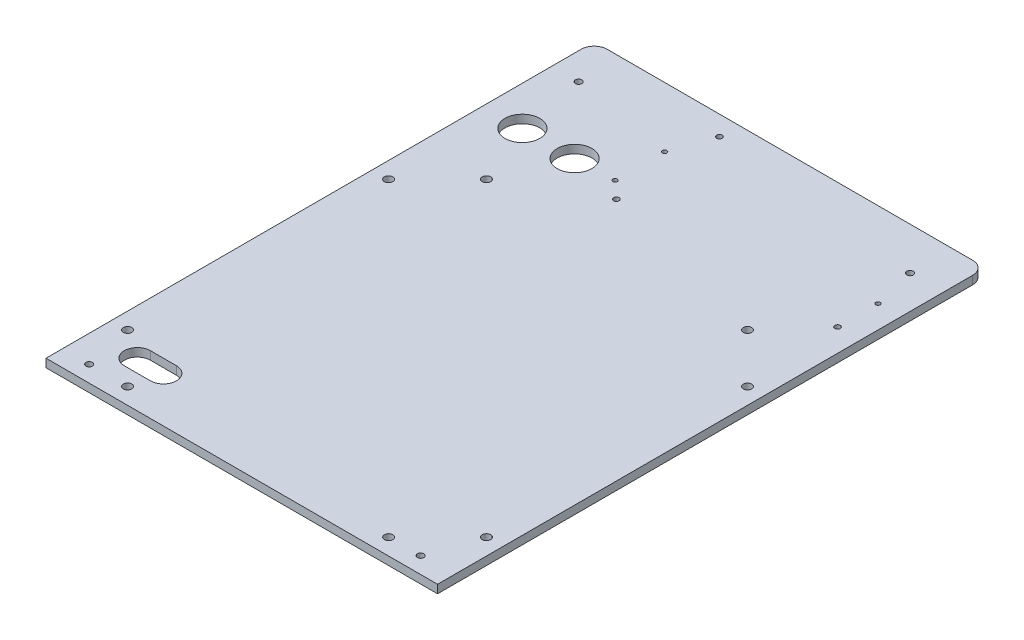
ISO-10303-21;
HEADER;
FILE_DESCRIPTION(('STEP AP214'),'2;1');
FILE_NAME('part.step','',(''),(''),'','','');
FILE_SCHEMA(('AUTOMOTIVE_DESIGN { 1 0 10303 214 1 1 1 1 }'));
ENDSEC;
DATA;
#1=APPLICATION_CONTEXT('core data for automotive mechanical design processes');
#2=APPLICATION_PROTOCOL_DEFINITION('international standard','automotive_design',2000,#1);
#3=PRODUCT_CONTEXT('',#1,'mechanical');
#4=PRODUCT('Part','Part','',(#3));
#5=PRODUCT_RELATED_PRODUCT_CATEGORY('part','',(#4));
#6=PRODUCT_DEFINITION_FORMATION('','',#4);
#7=PRODUCT_DEFINITION_CONTEXT('part definition',#1,'design');
#8=PRODUCT_DEFINITION('design','',#6,#7);
#9=PRODUCT_DEFINITION_SHAPE('','',#8);
#10=(LENGTH_UNIT() NAMED_UNIT(*) SI_UNIT(.MILLI.,.METRE.));
#11=(NAMED_UNIT(*) PLANE_ANGLE_UNIT() SI_UNIT($,.RADIAN.));
#12=(NAMED_UNIT(*) SI_UNIT($,.STERADIAN.) SOLID_ANGLE_UNIT());
#13=UNCERTAINTY_MEASURE_WITH_UNIT(LENGTH_MEASURE(1.E-05),#10,'distance_accuracy_value','');
#14=(GEOMETRIC_REPRESENTATION_CONTEXT(3) GLOBAL_UNCERTAINTY_ASSIGNED_CONTEXT((#13)) GLOBAL_UNIT_ASSIGNED_CONTEXT((#10,
#11,#12)) REPRESENTATION_CONTEXT('',''));
#15=CARTESIAN_POINT('',(0.,0.,0.));
#16=DIRECTION('',(0.,0.,1.));
#17=DIRECTION('',(1.,0.,0.));
#18=AXIS2_PLACEMENT_3D('',#15,#16,#17);
#19=CARTESIAN_POINT('',(300.,6.35,0.));
#20=DIRECTION('',(-1.,0.,0.));
#21=DIRECTION('',(0.,0.,1.));
#22=AXIS2_PLACEMENT_3D('',#19,#20,#21);
#23=PLANE('',#22);
#24=DIRECTION('',(0.,1.,0.));
#25=VECTOR('',#24,1.);
#26=CARTESIAN_POINT('',(300.,-3.65,-410.));
#27=LINE('',#26,#25);
#28=CARTESIAN_POINT('',(300.,0.,-410.));
#29=VERTEX_POINT('',#28);
#30=CARTESIAN_POINT('',(300.,6.35,-410.));
#31=VERTEX_POINT('',#30);
#32=EDGE_CURVE('E181',#29,#31,#27,.T.);
#33=ORIENTED_EDGE('',*,*,#32,.T.);
#34=DIRECTION('',(0.,0.,-1.));
#35=VECTOR('',#34,1.);
#36=CARTESIAN_POINT('',(300.,6.35,0.));
#37=LINE('',#36,#35);
#38=CARTESIAN_POINT('',(300.,6.35,0.));
#39=VERTEX_POINT('',#38);
#40=EDGE_CURVE('E288',#39,#31,#37,.T.);
#41=ORIENTED_EDGE('',*,*,#40,.F.);
#42=DIRECTION('',(0.,-1.,0.));
#43=VECTOR('',#42,1.);
#44=CARTESIAN_POINT('',(300.,6.35,0.));
#45=LINE('',#44,#43);
#46=CARTESIAN_POINT('',(300.,0.,0.));
#47=VERTEX_POINT('',#46);
#48=EDGE_CURVE('E294',#39,#47,#45,.T.);
#49=ORIENTED_EDGE('',*,*,#48,.T.);
#50=DIRECTION('',(0.,0.,-1.));
#51=VECTOR('',#50,1.);
#52=CARTESIAN_POINT('',(300.,0.,0.));
#53=LINE('',#52,#51);
#54=EDGE_CURVE('E298',#47,#29,#53,.T.);
#55=ORIENTED_EDGE('',*,*,#54,.T.);
#56=EDGE_LOOP('',(#33,#41,#49,#55));
#57=FACE_BOUND('',#56,.T.);
#58=ADVANCED_FACE('F36',(#57),#23,.F.);
#59=CARTESIAN_POINT('',(0.,6.35,-420.));
#60=DIRECTION('',(0.,0.,1.));
#61=DIRECTION('',(1.,0.,0.));
#62=AXIS2_PLACEMENT_3D('',#59,#60,#61);
#63=PLANE('',#62);
#64=DIRECTION('',(-1.,0.,0.));
#65=VECTOR('',#64,1.);
#66=CARTESIAN_POINT('',(0.,6.35,-420.));
#67=LINE('',#66,#65);
#68=CARTESIAN_POINT('',(290.,6.35,-420.));
#69=VERTEX_POINT('',#68);
#70=CARTESIAN_POINT('',(10.,6.35,-420.));
#71=VERTEX_POINT('',#70);
#72=EDGE_CURVE('E291',#69,#71,#67,.T.);
#73=ORIENTED_EDGE('',*,*,#72,.F.);
#74=DIRECTION('',(0.,1.,0.));
#75=VECTOR('',#74,1.);
#76=CARTESIAN_POINT('',(290.,-3.65,-420.));
#77=LINE('',#76,#75);
#78=CARTESIAN_POINT('',(290.,0.,-420.));
#79=VERTEX_POINT('',#78);
#80=EDGE_CURVE('E183',#79,#69,#77,.T.);
#81=ORIENTED_EDGE('',*,*,#80,.F.);
#82=DIRECTION('',(-1.,0.,0.));
#83=VECTOR('',#82,1.);
#84=CARTESIAN_POINT('',(0.,0.,-420.));
#85=LINE('',#84,#83);
#86=CARTESIAN_POINT('',(10.,0.,-420.));
#87=VERTEX_POINT('',#86);
#88=EDGE_CURVE('E286',#79,#87,#85,.T.);
#89=ORIENTED_EDGE('',*,*,#88,.T.);
#90=DIRECTION('',(0.,1.,0.));
#91=VECTOR('',#90,1.);
#92=CARTESIAN_POINT('',(10.,-3.65,-420.));
#93=LINE('',#92,#91);
#94=EDGE_CURVE('E189',#87,#71,#93,.T.);
#95=ORIENTED_EDGE('',*,*,#94,.T.);
#96=EDGE_LOOP('',(#73,#81,#89,#95));
#97=FACE_BOUND('',#96,.T.);
#98=ADVANCED_FACE('F332',(#97),#63,.F.);
#99=CARTESIAN_POINT('',(0.,6.35,0.));
#100=DIRECTION('',(1.,0.,0.));
#101=DIRECTION('',(0.,0.,-1.));
#102=AXIS2_PLACEMENT_3D('',#99,#100,#101);
#103=PLANE('',#102);
#104=DIRECTION('',(0.,0.,1.));
#105=VECTOR('',#104,1.);
#106=CARTESIAN_POINT('',(0.,6.35,0.));
#107=LINE('',#106,#105);
#108=CARTESIAN_POINT('',(0.,6.35,-410.));
#109=VERTEX_POINT('',#108);
#110=CARTESIAN_POINT('',(0.,6.35,0.));
#111=VERTEX_POINT('',#110);
#112=EDGE_CURVE('E283',#109,#111,#107,.T.);
#113=ORIENTED_EDGE('',*,*,#112,.F.);
#114=DIRECTION('',(0.,1.,0.));
#115=VECTOR('',#114,1.);
#116=CARTESIAN_POINT('',(0.,-3.65,-410.));
#117=LINE('',#116,#115);
#118=CARTESIAN_POINT('',(0.,0.,-410.));
#119=VERTEX_POINT('',#118);
#120=EDGE_CURVE('E182',#119,#109,#117,.T.);
#121=ORIENTED_EDGE('',*,*,#120,.F.);
#122=DIRECTION('',(0.,0.,1.));
#123=VECTOR('',#122,1.);
#124=CARTESIAN_POINT('',(0.,0.,0.));
#125=LINE('',#124,#123);
#126=CARTESIAN_POINT('',(0.,0.,0.));
#127=VERTEX_POINT('',#126);
#128=EDGE_CURVE('E280',#119,#127,#125,.T.);
#129=ORIENTED_EDGE('',*,*,#128,.T.);
#130=DIRECTION('',(0.,-1.,0.));
#131=VECTOR('',#130,1.);
#132=CARTESIAN_POINT('',(0.,6.35,0.));
#133=LINE('',#132,#131);
#134=EDGE_CURVE('E305',#111,#127,#133,.T.);
#135=ORIENTED_EDGE('',*,*,#134,.F.);
#136=EDGE_LOOP('',(#113,#121,#129,#135));
#137=FACE_BOUND('',#136,.T.);
#138=ADVANCED_FACE('F38',(#137),#103,.F.);
#139=CARTESIAN_POINT('',(0.,6.35,0.));
#140=DIRECTION('',(0.,0.,-1.));
#141=DIRECTION('',(-1.,0.,0.));
#142=AXIS2_PLACEMENT_3D('',#139,#140,#141);
#143=PLANE('',#142);
#144=DIRECTION('',(1.,0.,0.));
#145=VECTOR('',#144,1.);
#146=CARTESIAN_POINT('',(0.,0.,0.));
#147=LINE('',#146,#145);
#148=EDGE_CURVE('E296',#127,#47,#147,.T.);
#149=ORIENTED_EDGE('',*,*,#148,.T.);
#150=ORIENTED_EDGE('',*,*,#48,.F.);
#151=DIRECTION('',(1.,0.,0.));
#152=VECTOR('',#151,1.);
#153=CARTESIAN_POINT('',(0.,6.35,0.));
#154=LINE('',#153,#152);
#155=EDGE_CURVE('E285',#111,#39,#154,.T.);
#156=ORIENTED_EDGE('',*,*,#155,.F.);
#157=ORIENTED_EDGE('',*,*,#134,.T.);
#158=EDGE_LOOP('',(#149,#150,#156,#157));
#159=FACE_BOUND('',#158,.T.);
#160=ADVANCED_FACE('F325',(#159),#143,.F.);
#161=CARTESIAN_POINT('',(0.,6.35,0.));
#162=DIRECTION('',(0.,-1.,0.));
#163=DIRECTION('',(0.,0.,-1.));
#164=AXIS2_PLACEMENT_3D('',#161,#162,#163);
#165=PLANE('',#164);
#166=DIRECTION('',(-1.,0.,0.));
#167=VECTOR('',#166,1.);
#168=CARTESIAN_POINT('',(55.,6.35,-45.));
#169=LINE('',#168,#167);
#170=CARTESIAN_POINT('',(55.,6.35,-45.));
#171=VERTEX_POINT('',#170);
#172=CARTESIAN_POINT('',(35.,6.35,-45.));
#173=VERTEX_POINT('',#172);
#174=EDGE_CURVE('E139',#171,#173,#169,.T.);
#175=ORIENTED_EDGE('',*,*,#174,.F.);
#176=CARTESIAN_POINT('',(54.9999999999999,6.35,-35.));
#177=DIRECTION('',(0.,1.,0.));
#178=DIRECTION('',(0.,0.,1.));
#179=AXIS2_PLACEMENT_3D('',#176,#177,#178);
#180=CIRCLE('',#179,10.);
#181=CARTESIAN_POINT('',(55.,6.35,-25.));
#182=VERTEX_POINT('',#181);
#183=EDGE_CURVE('E51',#182,#171,#180,.T.);
#184=ORIENTED_EDGE('',*,*,#183,.F.);
#185=DIRECTION('',(1.,0.,0.));
#186=VECTOR('',#185,1.);
#187=CARTESIAN_POINT('',(55.,6.35,-25.));
#188=LINE('',#187,#186);
#189=CARTESIAN_POINT('',(35.,6.35,-25.));
#190=VERTEX_POINT('',#189);
#191=EDGE_CURVE('E130',#190,#182,#188,.T.);
#192=ORIENTED_EDGE('',*,*,#191,.F.);
#193=CARTESIAN_POINT('',(35.,6.35,-35.));
#194=DIRECTION('',(0.,1.,0.));
#195=DIRECTION('',(0.,0.,1.));
#196=AXIS2_PLACEMENT_3D('',#193,#194,#195);
#197=CIRCLE('',#196,10.);
#198=EDGE_CURVE('E133',#173,#190,#197,.T.);
#199=ORIENTED_EDGE('',*,*,#198,.F.);
#200=EDGE_LOOP('',(#175,#184,#192,#199));
#201=FACE_BOUND('',#200,.T.);
#202=CARTESIAN_POINT('',(282.5,6.35,-324.));
#203=DIRECTION('',(0.,1.,0.));
#204=DIRECTION('',(0.,0.,1.));
#205=AXIS2_PLACEMENT_3D('',#202,#203,#204);
#206=CIRCLE('',#205,2.09999999999999);
#207=CARTESIAN_POINT('',(282.5,6.35,-321.9));
#208=VERTEX_POINT('',#207);
#209=EDGE_CURVE('E153',#208,#208,#206,.T.);
#210=ORIENTED_EDGE('',*,*,#209,.F.);
#211=EDGE_LOOP('',(#210));
#212=FACE_BOUND('',#211,.T.);
#213=CARTESIAN_POINT('',(111.,6.35,-405.));
#214=DIRECTION('',(0.,1.,0.));
#215=DIRECTION('',(0.,0.,1.));
#216=AXIS2_PLACEMENT_3D('',#213,#214,#215);
#217=CIRCLE('',#216,2.1);
#218=CARTESIAN_POINT('',(111.,6.35,-402.9));
#219=VERTEX_POINT('',#218);
#220=EDGE_CURVE('E159',#219,#219,#217,.T.);
#221=ORIENTED_EDGE('',*,*,#220,.F.);
#222=EDGE_LOOP('',(#221));
#223=FACE_BOUND('',#222,.T.);
#224=CARTESIAN_POINT('',(113.,6.35,-324.));
#225=DIRECTION('',(0.,1.,0.));
#226=DIRECTION('',(0.,0.,1.));
#227=AXIS2_PLACEMENT_3D('',#224,#225,#226);
#228=CIRCLE('',#227,2.1);
#229=CARTESIAN_POINT('',(113.,6.35,-321.9));
#230=VERTEX_POINT('',#229);
#231=EDGE_CURVE('E145',#230,#230,#228,.T.);
#232=ORIENTED_EDGE('',*,*,#231,.F.);
#233=EDGE_LOOP('',(#232));
#234=FACE_BOUND('',#233,.T.);
#235=CARTESIAN_POINT('',(70.,6.35,-335.));
#236=DIRECTION('',(0.,1.,0.));
#237=DIRECTION('',(0.,0.,1.));
#238=AXIS2_PLACEMENT_3D('',#235,#236,#237);
#239=CIRCLE('',#238,13.335);
#240=CARTESIAN_POINT('',(70.,6.35,-321.665));
#241=VERTEX_POINT('',#240);
#242=EDGE_CURVE('E171',#241,#241,#239,.T.);
#243=ORIENTED_EDGE('',*,*,#242,.F.);
#244=EDGE_LOOP('',(#243));
#245=FACE_BOUND('',#244,.T.);
#246=CARTESIAN_POINT('',(30.,6.35,-335.));
#247=DIRECTION('',(0.,1.,0.));
#248=DIRECTION('',(0.,0.,1.));
#249=AXIS2_PLACEMENT_3D('',#246,#247,#248);
#250=CIRCLE('',#249,13.335);
#251=CARTESIAN_POINT('',(30.,6.35,-321.665));
#252=VERTEX_POINT('',#251);
#253=EDGE_CURVE('E152',#252,#252,#250,.T.);
#254=ORIENTED_EDGE('',*,*,#253,.F.);
#255=EDGE_LOOP('',(#254));
#256=FACE_BOUND('',#255,.T.);
#257=CARTESIAN_POINT('',(282.5,6.35,-355.));
#258=DIRECTION('',(0.,1.,0.));
#259=DIRECTION('',(0.,0.,1.));
#260=AXIS2_PLACEMENT_3D('',#257,#258,#259);
#261=CIRCLE('',#260,1.69999999999995);
#262=CARTESIAN_POINT('',(282.5,6.35,-353.3));
#263=VERTEX_POINT('',#262);
#264=EDGE_CURVE('E197',#263,#263,#261,.T.);
#265=ORIENTED_EDGE('',*,*,#264,.F.);
#266=EDGE_LOOP('',(#265));
#267=FACE_BOUND('',#266,.T.);
#268=CARTESIAN_POINT('',(100.,6.35,-336.));
#269=DIRECTION('',(0.,1.,0.));
#270=DIRECTION('',(0.,0.,1.));
#271=AXIS2_PLACEMENT_3D('',#268,#269,#270);
#272=CIRCLE('',#271,1.69999999999998);
#273=CARTESIAN_POINT('',(100.,6.35,-334.3));
#274=VERTEX_POINT('',#273);
#275=EDGE_CURVE('E203',#274,#274,#272,.T.);
#276=ORIENTED_EDGE('',*,*,#275,.F.);
#277=EDGE_LOOP('',(#276));
#278=FACE_BOUND('',#277,.T.);
#279=CARTESIAN_POINT('',(100.,6.35,-374.));
#280=DIRECTION('',(0.,1.,0.));
#281=DIRECTION('',(0.,0.,1.));
#282=AXIS2_PLACEMENT_3D('',#279,#280,#281);
#283=CIRCLE('',#282,1.69999999999998);
#284=CARTESIAN_POINT('',(100.,6.35,-372.3));
#285=VERTEX_POINT('',#284);
#286=EDGE_CURVE('E185',#285,#285,#283,.T.);
#287=ORIENTED_EDGE('',*,*,#286,.F.);
#288=EDGE_LOOP('',(#287));
#289=FACE_BOUND('',#288,.T.);
#290=CARTESIAN_POINT('',(274.55,6.35,-12.5));
#291=DIRECTION('',(0.,1.,0.));
#292=DIRECTION('',(0.,0.,1.));
#293=AXIS2_PLACEMENT_3D('',#290,#291,#292);
#294=CIRCLE('',#293,2.50000000000002);
#295=CARTESIAN_POINT('',(274.55,6.35,-9.99999999999998));
#296=VERTEX_POINT('',#295);
#297=EDGE_CURVE('E221',#296,#296,#294,.T.);
#298=ORIENTED_EDGE('',*,*,#297,.F.);
#299=EDGE_LOOP('',(#298));
#300=FACE_BOUND('',#299,.T.);
#301=CARTESIAN_POINT('',(20.55,6.35,-387.5));
#302=DIRECTION('',(0.,1.,0.));
#303=DIRECTION('',(0.,0.,1.));
#304=AXIS2_PLACEMENT_3D('',#301,#302,#303);
#305=CIRCLE('',#304,2.5);
#306=CARTESIAN_POINT('',(20.55,6.35,-385.));
#307=VERTEX_POINT('',#306);
#308=EDGE_CURVE('E214',#307,#307,#305,.T.);
#309=ORIENTED_EDGE('',*,*,#308,.F.);
#310=EDGE_LOOP('',(#309));
#311=FACE_BOUND('',#310,.T.);
#312=CARTESIAN_POINT('',(274.55,6.35,-387.5));
#313=DIRECTION('',(0.,1.,0.));
#314=DIRECTION('',(0.,0.,1.));
#315=AXIS2_PLACEMENT_3D('',#312,#313,#314);
#316=CIRCLE('',#315,2.50000000000002);
#317=CARTESIAN_POINT('',(274.55,6.35,-385.));
#318=VERTEX_POINT('',#317);
#319=EDGE_CURVE('E196',#318,#318,#316,.T.);
#320=ORIENTED_EDGE('',*,*,#319,.F.);
#321=EDGE_LOOP('',(#320));
#322=FACE_BOUND('',#321,.T.);
#323=CARTESIAN_POINT('',(20.55,6.35,-12.5));
#324=DIRECTION('',(0.,1.,0.));
#325=DIRECTION('',(0.,0.,1.));
#326=AXIS2_PLACEMENT_3D('',#323,#324,#325);
#327=CIRCLE('',#326,2.5);
#328=CARTESIAN_POINT('',(20.55,6.35,-10.));
#329=VERTEX_POINT('',#328);
#330=EDGE_CURVE('E220',#329,#329,#327,.T.);
#331=ORIENTED_EDGE('',*,*,#330,.F.);
#332=EDGE_LOOP('',(#331));
#333=FACE_BOUND('',#332,.T.);
#334=CARTESIAN_POINT('',(250.,6.35,-12.5));
#335=DIRECTION('',(0.,1.,0.));
#336=DIRECTION('',(0.,0.,1.));
#337=AXIS2_PLACEMENT_3D('',#334,#335,#336);
#338=CIRCLE('',#337,3.24999999999995);
#339=CARTESIAN_POINT('',(250.,6.35,-9.25000000000009));
#340=VERTEX_POINT('',#339);
#341=EDGE_CURVE('E257',#340,#340,#338,.T.);
#342=ORIENTED_EDGE('',*,*,#341,.F.);
#343=EDGE_LOOP('',(#342));
#344=FACE_BOUND('',#343,.T.);
#345=CARTESIAN_POINT('',(12.5,6.35,-50.));
#346=DIRECTION('',(0.,1.,0.));
#347=DIRECTION('',(0.,0.,1.));
#348=AXIS2_PLACEMENT_3D('',#345,#346,#347);
#349=CIRCLE('',#348,3.25);
#350=CARTESIAN_POINT('',(12.5,6.35,-46.75));
#351=VERTEX_POINT('',#350);
#352=EDGE_CURVE('E263',#351,#351,#349,.T.);
#353=ORIENTED_EDGE('',*,*,#352,.F.);
#354=EDGE_LOOP('',(#353));
#355=FACE_BOUND('',#354,.T.);
#356=CARTESIAN_POINT('',(12.5,6.35,-250.));
#357=DIRECTION('',(0.,1.,0.));
#358=DIRECTION('',(0.,0.,1.));
#359=AXIS2_PLACEMENT_3D('',#356,#357,#358);
#360=CIRCLE('',#359,3.25);
#361=CARTESIAN_POINT('',(12.5,6.35,-246.75));
#362=VERTEX_POINT('',#361);
#363=EDGE_CURVE('E269',#362,#362,#360,.T.);
#364=ORIENTED_EDGE('',*,*,#363,.F.);
#365=EDGE_LOOP('',(#364));
#366=FACE_BOUND('',#365,.T.);
#367=CARTESIAN_POINT('',(250.,6.35,-287.5));
#368=DIRECTION('',(0.,1.,0.));
#369=DIRECTION('',(0.,0.,-1.));
#370=AXIS2_PLACEMENT_3D('',#367,#368,#369);
#371=CIRCLE('',#370,3.24999999999986);
#372=CARTESIAN_POINT('',(250.,6.35,-290.75));
#373=VERTEX_POINT('',#372);
#374=EDGE_CURVE('E238',#373,#373,#371,.T.);
#375=ORIENTED_EDGE('',*,*,#374,.F.);
#376=EDGE_LOOP('',(#375));
#377=FACE_BOUND('',#376,.T.);
#378=CARTESIAN_POINT('',(50.,6.35,-287.5));
#379=DIRECTION('',(0.,1.,0.));
#380=DIRECTION('',(0.,0.,-1.));
#381=AXIS2_PLACEMENT_3D('',#378,#379,#380);
#382=CIRCLE('',#381,3.25);
#383=CARTESIAN_POINT('',(50.,6.35,-290.75));
#384=VERTEX_POINT('',#383);
#385=EDGE_CURVE('E239',#384,#384,#382,.T.);
#386=ORIENTED_EDGE('',*,*,#385,.F.);
#387=EDGE_LOOP('',(#386));
#388=FACE_BOUND('',#387,.T.);
#389=CARTESIAN_POINT('',(287.5,6.35,-250.));
#390=DIRECTION('',(0.,1.,0.));
#391=DIRECTION('',(0.,0.,-1.));
#392=AXIS2_PLACEMENT_3D('',#389,#390,#391);
#393=CIRCLE('',#392,3.25000000000001);
#394=CARTESIAN_POINT('',(287.5,6.35,-253.25));
#395=VERTEX_POINT('',#394);
#396=EDGE_CURVE('E245',#395,#395,#393,.T.);
#397=ORIENTED_EDGE('',*,*,#396,.F.);
#398=EDGE_LOOP('',(#397));
#399=FACE_BOUND('',#398,.T.);
#400=CARTESIAN_POINT('',(287.5,6.35,-50.));
#401=DIRECTION('',(0.,1.,0.));
#402=DIRECTION('',(0.,0.,-1.));
#403=AXIS2_PLACEMENT_3D('',#400,#401,#402);
#404=CIRCLE('',#403,3.25000000000001);
#405=CARTESIAN_POINT('',(287.5,6.35,-53.25));
#406=VERTEX_POINT('',#405);
#407=EDGE_CURVE('E232',#406,#406,#404,.T.);
#408=ORIENTED_EDGE('',*,*,#407,.F.);
#409=EDGE_LOOP('',(#408));
#410=FACE_BOUND('',#409,.T.);
#411=CARTESIAN_POINT('',(50.,6.35,-12.5));
#412=DIRECTION('',(0.,1.,0.));
#413=DIRECTION('',(0.,0.,1.));
#414=AXIS2_PLACEMENT_3D('',#411,#412,#413);
#415=CIRCLE('',#414,3.25);
#416=CARTESIAN_POINT('',(50.,6.35,-9.25000000000001));
#417=VERTEX_POINT('',#416);
#418=EDGE_CURVE('E256',#417,#417,#415,.T.);
#419=ORIENTED_EDGE('',*,*,#418,.F.);
#420=EDGE_LOOP('',(#419));
#421=FACE_BOUND('',#420,.T.);
#422=ORIENTED_EDGE('',*,*,#40,.T.);
#423=CARTESIAN_POINT('',(290.,6.35,-410.));
#424=DIRECTION('',(0.,-1.,0.));
#425=DIRECTION('',(0.,0.,1.));
#426=AXIS2_PLACEMENT_3D('',#423,#424,#425);
#427=CIRCLE('',#426,10.);
#428=EDGE_CURVE('E179',#69,#31,#427,.T.);
#429=ORIENTED_EDGE('',*,*,#428,.F.);
#430=ORIENTED_EDGE('',*,*,#72,.T.);
#431=CARTESIAN_POINT('',(10.,6.35,-410.));
#432=DIRECTION('',(0.,-1.,0.));
#433=DIRECTION('',(0.,0.,-1.));
#434=AXIS2_PLACEMENT_3D('',#431,#432,#433);
#435=CIRCLE('',#434,10.);
#436=EDGE_CURVE('E170',#109,#71,#435,.T.);
#437=ORIENTED_EDGE('',*,*,#436,.F.);
#438=ORIENTED_EDGE('',*,*,#112,.T.);
#439=ORIENTED_EDGE('',*,*,#155,.T.);
#440=EDGE_LOOP('',(#422,#429,#430,#437,#438,#439));
#441=FACE_BOUND('',#440,.T.);
#442=ADVANCED_FACE('F328',(#201,#212,#223,#234,#245,#256,#267,#278,#289,#300,#311,#322,#333,
#344,#355,#366,#377,#388,#399,#410,#421,#441),#165,.F.);
#443=CARTESIAN_POINT('',(0.,0.,0.));
#444=DIRECTION('',(0.,-1.,0.));
#445=DIRECTION('',(0.,0.,-1.));
#446=AXIS2_PLACEMENT_3D('',#443,#444,#445);
#447=PLANE('',#446);
#448=CARTESIAN_POINT('',(54.9999999999999,0.,-35.));
#449=DIRECTION('',(0.,1.,0.));
#450=DIRECTION('',(0.,0.,1.));
#451=AXIS2_PLACEMENT_3D('',#448,#449,#450);
#452=CIRCLE('',#451,10.);
#453=CARTESIAN_POINT('',(55.,0.,-25.));
#454=VERTEX_POINT('',#453);
#455=CARTESIAN_POINT('',(55.,0.,-45.));
#456=VERTEX_POINT('',#455);
#457=EDGE_CURVE('E114',#454,#456,#452,.T.);
#458=ORIENTED_EDGE('',*,*,#457,.T.);
#459=DIRECTION('',(-1.,0.,0.));
#460=VECTOR('',#459,1.);
#461=CARTESIAN_POINT('',(55.,0.,-45.));
#462=LINE('',#461,#460);
#463=CARTESIAN_POINT('',(35.,0.,-45.));
#464=VERTEX_POINT('',#463);
#465=EDGE_CURVE('E123',#456,#464,#462,.T.);
#466=ORIENTED_EDGE('',*,*,#465,.T.);
#467=CARTESIAN_POINT('',(35.,0.,-35.));
#468=DIRECTION('',(0.,1.,0.));
#469=DIRECTION('',(0.,0.,1.));
#470=AXIS2_PLACEMENT_3D('',#467,#468,#469);
#471=CIRCLE('',#470,10.);
#472=CARTESIAN_POINT('',(35.,0.,-25.));
#473=VERTEX_POINT('',#472);
#474=EDGE_CURVE('E59',#464,#473,#471,.T.);
#475=ORIENTED_EDGE('',*,*,#474,.T.);
#476=DIRECTION('',(1.,0.,0.));
#477=VECTOR('',#476,1.);
#478=CARTESIAN_POINT('',(55.,0.,-25.));
#479=LINE('',#478,#477);
#480=EDGE_CURVE('E120',#473,#454,#479,.T.);
#481=ORIENTED_EDGE('',*,*,#480,.T.);
#482=EDGE_LOOP('',(#458,#466,#475,#481));
#483=FACE_BOUND('',#482,.T.);
#484=CARTESIAN_POINT('',(282.5,0.,-324.));
#485=DIRECTION('',(0.,1.,0.));
#486=DIRECTION('',(0.,0.,1.));
#487=AXIS2_PLACEMENT_3D('',#484,#485,#486);
#488=CIRCLE('',#487,2.09999999999999);
#489=CARTESIAN_POINT('',(282.5,0.,-321.9));
#490=VERTEX_POINT('',#489);
#491=EDGE_CURVE('E149',#490,#490,#488,.T.);
#492=ORIENTED_EDGE('',*,*,#491,.T.);
#493=EDGE_LOOP('',(#492));
#494=FACE_BOUND('',#493,.T.);
#495=CARTESIAN_POINT('',(111.,0.,-405.));
#496=DIRECTION('',(0.,1.,0.));
#497=DIRECTION('',(0.,0.,1.));
#498=AXIS2_PLACEMENT_3D('',#495,#496,#497);
#499=CIRCLE('',#498,2.1);
#500=CARTESIAN_POINT('',(111.,0.,-402.9));
#501=VERTEX_POINT('',#500);
#502=EDGE_CURVE('E156',#501,#501,#499,.T.);
#503=ORIENTED_EDGE('',*,*,#502,.T.);
#504=EDGE_LOOP('',(#503));
#505=FACE_BOUND('',#504,.T.);
#506=CARTESIAN_POINT('',(113.,0.,-324.));
#507=DIRECTION('',(0.,1.,0.));
#508=DIRECTION('',(0.,0.,1.));
#509=AXIS2_PLACEMENT_3D('',#506,#507,#508);
#510=CIRCLE('',#509,2.1);
#511=CARTESIAN_POINT('',(113.,0.,-321.9));
#512=VERTEX_POINT('',#511);
#513=EDGE_CURVE('E162',#512,#512,#510,.T.);
#514=ORIENTED_EDGE('',*,*,#513,.T.);
#515=EDGE_LOOP('',(#514));
#516=FACE_BOUND('',#515,.T.);
#517=CARTESIAN_POINT('',(70.,0.,-335.));
#518=DIRECTION('',(0.,1.,0.));
#519=DIRECTION('',(0.,0.,1.));
#520=AXIS2_PLACEMENT_3D('',#517,#518,#519);
#521=CIRCLE('',#520,13.335);
#522=CARTESIAN_POINT('',(70.,0.,-321.665));
#523=VERTEX_POINT('',#522);
#524=EDGE_CURVE('E167',#523,#523,#521,.T.);
#525=ORIENTED_EDGE('',*,*,#524,.T.);
#526=EDGE_LOOP('',(#525));
#527=FACE_BOUND('',#526,.T.);
#528=CARTESIAN_POINT('',(30.,0.,-335.));
#529=DIRECTION('',(0.,1.,0.));
#530=DIRECTION('',(0.,0.,1.));
#531=AXIS2_PLACEMENT_3D('',#528,#529,#530);
#532=CIRCLE('',#531,13.335);
#533=CARTESIAN_POINT('',(30.,0.,-321.665));
#534=VERTEX_POINT('',#533);
#535=EDGE_CURVE('E174',#534,#534,#532,.T.);
#536=ORIENTED_EDGE('',*,*,#535,.T.);
#537=EDGE_LOOP('',(#536));
#538=FACE_BOUND('',#537,.T.);
#539=CARTESIAN_POINT('',(290.,0.,-410.));
#540=DIRECTION('',(0.,-1.,0.));
#541=DIRECTION('',(0.,0.,-1.));
#542=AXIS2_PLACEMENT_3D('',#539,#540,#541);
#543=CIRCLE('',#542,10.);
#544=EDGE_CURVE('E11',#29,#79,#543,.F.);
#545=ORIENTED_EDGE('',*,*,#544,.F.);
#546=ORIENTED_EDGE('',*,*,#54,.F.);
#547=ORIENTED_EDGE('',*,*,#148,.F.);
#548=ORIENTED_EDGE('',*,*,#128,.F.);
#549=CARTESIAN_POINT('',(10.,0.,-410.));
#550=DIRECTION('',(0.,-1.,0.));
#551=DIRECTION('',(0.,0.,-1.));
#552=AXIS2_PLACEMENT_3D('',#549,#550,#551);
#553=CIRCLE('',#552,10.);
#554=EDGE_CURVE('E44',#87,#119,#553,.F.);
#555=ORIENTED_EDGE('',*,*,#554,.F.);
#556=ORIENTED_EDGE('',*,*,#88,.F.);
#557=EDGE_LOOP('',(#545,#546,#547,#548,#555,#556));
#558=FACE_BOUND('',#557,.T.);
#559=CARTESIAN_POINT('',(282.5,0.,-355.));
#560=DIRECTION('',(0.,1.,0.));
#561=DIRECTION('',(0.,0.,1.));
#562=AXIS2_PLACEMENT_3D('',#559,#560,#561);
#563=CIRCLE('',#562,1.69999999999995);
#564=CARTESIAN_POINT('',(282.5,0.,-353.3));
#565=VERTEX_POINT('',#564);
#566=EDGE_CURVE('E193',#565,#565,#563,.T.);
#567=ORIENTED_EDGE('',*,*,#566,.T.);
#568=EDGE_LOOP('',(#567));
#569=FACE_BOUND('',#568,.T.);
#570=CARTESIAN_POINT('',(100.,0.,-336.));
#571=DIRECTION('',(0.,1.,0.));
#572=DIRECTION('',(0.,0.,1.));
#573=AXIS2_PLACEMENT_3D('',#570,#571,#572);
#574=CIRCLE('',#573,1.69999999999998);
#575=CARTESIAN_POINT('',(100.,0.,-334.3));
#576=VERTEX_POINT('',#575);
#577=EDGE_CURVE('E200',#576,#576,#574,.T.);
#578=ORIENTED_EDGE('',*,*,#577,.T.);
#579=EDGE_LOOP('',(#578));
#580=FACE_BOUND('',#579,.T.);
#581=CARTESIAN_POINT('',(100.,0.,-374.));
#582=DIRECTION('',(0.,1.,0.));
#583=DIRECTION('',(0.,0.,1.));
#584=AXIS2_PLACEMENT_3D('',#581,#582,#583);
#585=CIRCLE('',#584,1.69999999999998);
#586=CARTESIAN_POINT('',(100.,0.,-372.3));
#587=VERTEX_POINT('',#586);
#588=EDGE_CURVE('E206',#587,#587,#585,.T.);
#589=ORIENTED_EDGE('',*,*,#588,.T.);
#590=EDGE_LOOP('',(#589));
#591=FACE_BOUND('',#590,.T.);
#592=CARTESIAN_POINT('',(274.55,0.,-12.5));
#593=DIRECTION('',(0.,1.,0.));
#594=DIRECTION('',(0.,0.,1.));
#595=AXIS2_PLACEMENT_3D('',#592,#593,#594);
#596=CIRCLE('',#595,2.50000000000002);
#597=CARTESIAN_POINT('',(274.55,0.,-9.99999999999998));
#598=VERTEX_POINT('',#597);
#599=EDGE_CURVE('E217',#598,#598,#596,.T.);
#600=ORIENTED_EDGE('',*,*,#599,.T.);
#601=EDGE_LOOP('',(#600));
#602=FACE_BOUND('',#601,.T.);
#603=CARTESIAN_POINT('',(20.55,0.,-387.5));
#604=DIRECTION('',(0.,1.,0.));
#605=DIRECTION('',(0.,0.,1.));
#606=AXIS2_PLACEMENT_3D('',#603,#604,#605);
#607=CIRCLE('',#606,2.5);
#608=CARTESIAN_POINT('',(20.55,0.,-385.));
#609=VERTEX_POINT('',#608);
#610=EDGE_CURVE('E224',#609,#609,#607,.T.);
#611=ORIENTED_EDGE('',*,*,#610,.T.);
#612=EDGE_LOOP('',(#611));
#613=FACE_BOUND('',#612,.T.);
#614=CARTESIAN_POINT('',(274.55,0.,-387.5));
#615=DIRECTION('',(0.,1.,0.));
#616=DIRECTION('',(0.,0.,1.));
#617=AXIS2_PLACEMENT_3D('',#614,#615,#616);
#618=CIRCLE('',#617,2.50000000000002);
#619=CARTESIAN_POINT('',(274.55,0.,-385.));
#620=VERTEX_POINT('',#619);
#621=EDGE_CURVE('E211',#620,#620,#618,.T.);
#622=ORIENTED_EDGE('',*,*,#621,.T.);
#623=EDGE_LOOP('',(#622));
#624=FACE_BOUND('',#623,.T.);
#625=CARTESIAN_POINT('',(20.55,0.,-12.5));
#626=DIRECTION('',(0.,1.,0.));
#627=DIRECTION('',(0.,0.,1.));
#628=AXIS2_PLACEMENT_3D('',#625,#626,#627);
#629=CIRCLE('',#628,2.5);
#630=CARTESIAN_POINT('',(20.55,0.,-10.));
#631=VERTEX_POINT('',#630);
#632=EDGE_CURVE('E229',#631,#631,#629,.T.);
#633=ORIENTED_EDGE('',*,*,#632,.T.);
#634=EDGE_LOOP('',(#633));
#635=FACE_BOUND('',#634,.T.);
#636=CARTESIAN_POINT('',(250.,0.,-12.5));
#637=DIRECTION('',(0.,1.,0.));
#638=DIRECTION('',(0.,0.,1.));
#639=AXIS2_PLACEMENT_3D('',#636,#637,#638);
#640=CIRCLE('',#639,3.24999999999995);
#641=CARTESIAN_POINT('',(250.,0.,-9.25000000000009));
#642=VERTEX_POINT('',#641);
#643=EDGE_CURVE('E253',#642,#642,#640,.T.);
#644=ORIENTED_EDGE('',*,*,#643,.T.);
#645=EDGE_LOOP('',(#644));
#646=FACE_BOUND('',#645,.T.);
#647=CARTESIAN_POINT('',(12.5,0.,-50.));
#648=DIRECTION('',(0.,1.,0.));
#649=DIRECTION('',(0.,0.,1.));
#650=AXIS2_PLACEMENT_3D('',#647,#648,#649);
#651=CIRCLE('',#650,3.25);
#652=CARTESIAN_POINT('',(12.5,0.,-46.75));
#653=VERTEX_POINT('',#652);
#654=EDGE_CURVE('E260',#653,#653,#651,.T.);
#655=ORIENTED_EDGE('',*,*,#654,.T.);
#656=EDGE_LOOP('',(#655));
#657=FACE_BOUND('',#656,.T.);
#658=CARTESIAN_POINT('',(12.5,0.,-250.));
#659=DIRECTION('',(0.,1.,0.));
#660=DIRECTION('',(0.,0.,1.));
#661=AXIS2_PLACEMENT_3D('',#658,#659,#660);
#662=CIRCLE('',#661,3.25);
#663=CARTESIAN_POINT('',(12.5,0.,-246.75));
#664=VERTEX_POINT('',#663);
#665=EDGE_CURVE('E266',#664,#664,#662,.T.);
#666=ORIENTED_EDGE('',*,*,#665,.T.);
#667=EDGE_LOOP('',(#666));
#668=FACE_BOUND('',#667,.T.);
#669=CARTESIAN_POINT('',(250.,0.,-287.5));
#670=DIRECTION('',(0.,1.,0.));
#671=DIRECTION('',(0.,0.,-1.));
#672=AXIS2_PLACEMENT_3D('',#669,#670,#671);
#673=CIRCLE('',#672,3.24999999999986);
#674=CARTESIAN_POINT('',(250.,0.,-290.75));
#675=VERTEX_POINT('',#674);
#676=EDGE_CURVE('E272',#675,#675,#673,.T.);
#677=ORIENTED_EDGE('',*,*,#676,.T.);
#678=EDGE_LOOP('',(#677));
#679=FACE_BOUND('',#678,.T.);
#680=CARTESIAN_POINT('',(50.,0.,-287.5));
#681=DIRECTION('',(0.,1.,0.));
#682=DIRECTION('',(0.,0.,-1.));
#683=AXIS2_PLACEMENT_3D('',#680,#681,#682);
#684=CIRCLE('',#683,3.25);
#685=CARTESIAN_POINT('',(50.,0.,-290.75));
#686=VERTEX_POINT('',#685);
#687=EDGE_CURVE('E235',#686,#686,#684,.T.);
#688=ORIENTED_EDGE('',*,*,#687,.T.);
#689=EDGE_LOOP('',(#688));
#690=FACE_BOUND('',#689,.T.);
#691=CARTESIAN_POINT('',(287.5,0.,-250.));
#692=DIRECTION('',(0.,1.,0.));
#693=DIRECTION('',(0.,0.,-1.));
#694=AXIS2_PLACEMENT_3D('',#691,#692,#693);
#695=CIRCLE('',#694,3.25000000000001);
#696=CARTESIAN_POINT('',(287.5,0.,-253.25));
#697=VERTEX_POINT('',#696);
#698=EDGE_CURVE('E242',#697,#697,#695,.T.);
#699=ORIENTED_EDGE('',*,*,#698,.T.);
#700=EDGE_LOOP('',(#699));
#701=FACE_BOUND('',#700,.T.);
#702=CARTESIAN_POINT('',(287.5,0.,-50.));
#703=DIRECTION('',(0.,1.,0.));
#704=DIRECTION('',(0.,0.,-1.));
#705=AXIS2_PLACEMENT_3D('',#702,#703,#704);
#706=CIRCLE('',#705,3.25000000000001);
#707=CARTESIAN_POINT('',(287.5,0.,-53.25));
#708=VERTEX_POINT('',#707);
#709=EDGE_CURVE('E248',#708,#708,#706,.T.);
#710=ORIENTED_EDGE('',*,*,#709,.T.);
#711=EDGE_LOOP('',(#710));
#712=FACE_BOUND('',#711,.T.);
#713=CARTESIAN_POINT('',(50.,0.,-12.5));
#714=DIRECTION('',(0.,1.,0.));
#715=DIRECTION('',(0.,0.,1.));
#716=AXIS2_PLACEMENT_3D('',#713,#714,#715);
#717=CIRCLE('',#716,3.25);
#718=CARTESIAN_POINT('',(50.,0.,-9.25000000000001));
#719=VERTEX_POINT('',#718);
#720=EDGE_CURVE('E277',#719,#719,#717,.T.);
#721=ORIENTED_EDGE('',*,*,#720,.T.);
#722=EDGE_LOOP('',(#721));
#723=FACE_BOUND('',#722,.T.);
#724=ADVANCED_FACE('F127',(#483,#494,#505,#516,#527,#538,#558,#569,#580,#591,#602,#613,#624,
#635,#646,#657,#668,#679,#690,#701,#712,#723),#447,.T.);
#725=CARTESIAN_POINT('',(50.,0.,-12.5));
#726=DIRECTION('',(0.,1.,0.));
#727=DIRECTION('',(0.,0.,1.));
#728=AXIS2_PLACEMENT_3D('',#725,#726,#727);
#729=CYLINDRICAL_SURFACE('',#728,3.25);
#730=ORIENTED_EDGE('',*,*,#720,.F.);
#731=EDGE_LOOP('',(#730));
#732=FACE_BOUND('',#731,.T.);
#733=ORIENTED_EDGE('',*,*,#418,.T.);
#734=EDGE_LOOP('',(#733));
#735=FACE_BOUND('',#734,.T.);
#736=ADVANCED_FACE('F514',(#732,#735),#729,.F.);
#737=CARTESIAN_POINT('',(287.5,0.,-50.));
#738=DIRECTION('',(0.,1.,0.));
#739=DIRECTION('',(0.,0.,1.));
#740=AXIS2_PLACEMENT_3D('',#737,#738,#739);
#741=CYLINDRICAL_SURFACE('',#740,3.25000000000001);
#742=ORIENTED_EDGE('',*,*,#709,.F.);
#743=EDGE_LOOP('',(#742));
#744=FACE_BOUND('',#743,.T.);
#745=ORIENTED_EDGE('',*,*,#407,.T.);
#746=EDGE_LOOP('',(#745));
#747=FACE_BOUND('',#746,.T.);
#748=ADVANCED_FACE('F504',(#744,#747),#741,.F.);
#749=CARTESIAN_POINT('',(287.5,0.,-250.));
#750=DIRECTION('',(0.,1.,0.));
#751=DIRECTION('',(0.,0.,1.));
#752=AXIS2_PLACEMENT_3D('',#749,#750,#751);
#753=CYLINDRICAL_SURFACE('',#752,3.25000000000001);
#754=ORIENTED_EDGE('',*,*,#698,.F.);
#755=EDGE_LOOP('',(#754));
#756=FACE_BOUND('',#755,.T.);
#757=ORIENTED_EDGE('',*,*,#396,.T.);
#758=EDGE_LOOP('',(#757));
#759=FACE_BOUND('',#758,.T.);
#760=ADVANCED_FACE('F494',(#756,#759),#753,.F.);
#761=CARTESIAN_POINT('',(50.,0.,-287.5));
#762=DIRECTION('',(0.,1.,0.));
#763=DIRECTION('',(0.,0.,1.));
#764=AXIS2_PLACEMENT_3D('',#761,#762,#763);
#765=CYLINDRICAL_SURFACE('',#764,3.25);
#766=ORIENTED_EDGE('',*,*,#687,.F.);
#767=EDGE_LOOP('',(#766));
#768=FACE_BOUND('',#767,.T.);
#769=ORIENTED_EDGE('',*,*,#385,.T.);
#770=EDGE_LOOP('',(#769));
#771=FACE_BOUND('',#770,.T.);
#772=ADVANCED_FACE('F484',(#768,#771),#765,.F.);
#773=CARTESIAN_POINT('',(250.,0.,-287.5));
#774=DIRECTION('',(0.,1.,0.));
#775=DIRECTION('',(0.,0.,1.));
#776=AXIS2_PLACEMENT_3D('',#773,#774,#775);
#777=CYLINDRICAL_SURFACE('',#776,3.24999999999986);
#778=ORIENTED_EDGE('',*,*,#676,.F.);
#779=EDGE_LOOP('',(#778));
#780=FACE_BOUND('',#779,.T.);
#781=ORIENTED_EDGE('',*,*,#374,.T.);
#782=EDGE_LOOP('',(#781));
#783=FACE_BOUND('',#782,.T.);
#784=ADVANCED_FACE('F474',(#780,#783),#777,.F.);
#785=CARTESIAN_POINT('',(12.5,0.,-250.));
#786=DIRECTION('',(0.,1.,0.));
#787=DIRECTION('',(0.,0.,1.));
#788=AXIS2_PLACEMENT_3D('',#785,#786,#787);
#789=CYLINDRICAL_SURFACE('',#788,3.25);
#790=ORIENTED_EDGE('',*,*,#665,.F.);
#791=EDGE_LOOP('',(#790));
#792=FACE_BOUND('',#791,.T.);
#793=ORIENTED_EDGE('',*,*,#363,.T.);
#794=EDGE_LOOP('',(#793));
#795=FACE_BOUND('',#794,.T.);
#796=ADVANCED_FACE('F464',(#792,#795),#789,.F.);
#797=CARTESIAN_POINT('',(12.5,0.,-50.));
#798=DIRECTION('',(0.,1.,0.));
#799=DIRECTION('',(0.,0.,1.));
#800=AXIS2_PLACEMENT_3D('',#797,#798,#799);
#801=CYLINDRICAL_SURFACE('',#800,3.25);
#802=ORIENTED_EDGE('',*,*,#654,.F.);
#803=EDGE_LOOP('',(#802));
#804=FACE_BOUND('',#803,.T.);
#805=ORIENTED_EDGE('',*,*,#352,.T.);
#806=EDGE_LOOP('',(#805));
#807=FACE_BOUND('',#806,.T.);
#808=ADVANCED_FACE('F454',(#804,#807),#801,.F.);
#809=CARTESIAN_POINT('',(250.,0.,-12.5));
#810=DIRECTION('',(0.,1.,0.));
#811=DIRECTION('',(0.,0.,1.));
#812=AXIS2_PLACEMENT_3D('',#809,#810,#811);
#813=CYLINDRICAL_SURFACE('',#812,3.24999999999995);
#814=ORIENTED_EDGE('',*,*,#643,.F.);
#815=EDGE_LOOP('',(#814));
#816=FACE_BOUND('',#815,.T.);
#817=ORIENTED_EDGE('',*,*,#341,.T.);
#818=EDGE_LOOP('',(#817));
#819=FACE_BOUND('',#818,.T.);
#820=ADVANCED_FACE('F444',(#816,#819),#813,.F.);
#821=CARTESIAN_POINT('',(20.55,0.,-12.5));
#822=DIRECTION('',(0.,1.,0.));
#823=DIRECTION('',(0.,0.,1.));
#824=AXIS2_PLACEMENT_3D('',#821,#822,#823);
#825=CYLINDRICAL_SURFACE('',#824,2.5);
#826=ORIENTED_EDGE('',*,*,#632,.F.);
#827=EDGE_LOOP('',(#826));
#828=FACE_BOUND('',#827,.T.);
#829=ORIENTED_EDGE('',*,*,#330,.T.);
#830=EDGE_LOOP('',(#829));
#831=FACE_BOUND('',#830,.T.);
#832=ADVANCED_FACE('F434',(#828,#831),#825,.F.);
#833=CARTESIAN_POINT('',(274.55,0.,-387.5));
#834=DIRECTION('',(0.,1.,0.));
#835=DIRECTION('',(0.,0.,1.));
#836=AXIS2_PLACEMENT_3D('',#833,#834,#835);
#837=CYLINDRICAL_SURFACE('',#836,2.50000000000002);
#838=ORIENTED_EDGE('',*,*,#621,.F.);
#839=EDGE_LOOP('',(#838));
#840=FACE_BOUND('',#839,.T.);
#841=ORIENTED_EDGE('',*,*,#319,.T.);
#842=EDGE_LOOP('',(#841));
#843=FACE_BOUND('',#842,.T.);
#844=ADVANCED_FACE('F424',(#840,#843),#837,.F.);
#845=CARTESIAN_POINT('',(20.55,0.,-387.5));
#846=DIRECTION('',(0.,1.,0.));
#847=DIRECTION('',(0.,0.,1.));
#848=AXIS2_PLACEMENT_3D('',#845,#846,#847);
#849=CYLINDRICAL_SURFACE('',#848,2.5);
#850=ORIENTED_EDGE('',*,*,#610,.F.);
#851=EDGE_LOOP('',(#850));
#852=FACE_BOUND('',#851,.T.);
#853=ORIENTED_EDGE('',*,*,#308,.T.);
#854=EDGE_LOOP('',(#853));
#855=FACE_BOUND('',#854,.T.);
#856=ADVANCED_FACE('F414',(#852,#855),#849,.F.);
#857=CARTESIAN_POINT('',(274.55,0.,-12.5));
#858=DIRECTION('',(0.,1.,0.));
#859=DIRECTION('',(0.,0.,1.));
#860=AXIS2_PLACEMENT_3D('',#857,#858,#859);
#861=CYLINDRICAL_SURFACE('',#860,2.50000000000002);
#862=ORIENTED_EDGE('',*,*,#599,.F.);
#863=EDGE_LOOP('',(#862));
#864=FACE_BOUND('',#863,.T.);
#865=ORIENTED_EDGE('',*,*,#297,.T.);
#866=EDGE_LOOP('',(#865));
#867=FACE_BOUND('',#866,.T.);
#868=ADVANCED_FACE('F404',(#864,#867),#861,.F.);
#869=CARTESIAN_POINT('',(100.,0.,-374.));
#870=DIRECTION('',(0.,1.,0.));
#871=DIRECTION('',(0.,0.,1.));
#872=AXIS2_PLACEMENT_3D('',#869,#870,#871);
#873=CYLINDRICAL_SURFACE('',#872,1.69999999999998);
#874=ORIENTED_EDGE('',*,*,#588,.F.);
#875=EDGE_LOOP('',(#874));
#876=FACE_BOUND('',#875,.T.);
#877=ORIENTED_EDGE('',*,*,#286,.T.);
#878=EDGE_LOOP('',(#877));
#879=FACE_BOUND('',#878,.T.);
#880=ADVANCED_FACE('F394',(#876,#879),#873,.F.);
#881=CARTESIAN_POINT('',(100.,0.,-336.));
#882=DIRECTION('',(0.,1.,0.));
#883=DIRECTION('',(0.,0.,1.));
#884=AXIS2_PLACEMENT_3D('',#881,#882,#883);
#885=CYLINDRICAL_SURFACE('',#884,1.69999999999998);
#886=ORIENTED_EDGE('',*,*,#577,.F.);
#887=EDGE_LOOP('',(#886));
#888=FACE_BOUND('',#887,.T.);
#889=ORIENTED_EDGE('',*,*,#275,.T.);
#890=EDGE_LOOP('',(#889));
#891=FACE_BOUND('',#890,.T.);
#892=ADVANCED_FACE('F384',(#888,#891),#885,.F.);
#893=CARTESIAN_POINT('',(282.5,0.,-355.));
#894=DIRECTION('',(0.,1.,0.));
#895=DIRECTION('',(0.,0.,1.));
#896=AXIS2_PLACEMENT_3D('',#893,#894,#895);
#897=CYLINDRICAL_SURFACE('',#896,1.69999999999995);
#898=ORIENTED_EDGE('',*,*,#566,.F.);
#899=EDGE_LOOP('',(#898));
#900=FACE_BOUND('',#899,.T.);
#901=ORIENTED_EDGE('',*,*,#264,.T.);
#902=EDGE_LOOP('',(#901));
#903=FACE_BOUND('',#902,.T.);
#904=ADVANCED_FACE('F347',(#900,#903),#897,.F.);
#905=CARTESIAN_POINT('',(10.,-3.65,-410.));
#906=DIRECTION('',(0.,1.,0.));
#907=DIRECTION('',(0.,0.,1.));
#908=AXIS2_PLACEMENT_3D('',#905,#906,#907);
#909=CYLINDRICAL_SURFACE('',#908,10.);
#910=ORIENTED_EDGE('',*,*,#554,.T.);
#911=ORIENTED_EDGE('',*,*,#120,.T.);
#912=ORIENTED_EDGE('',*,*,#436,.T.);
#913=ORIENTED_EDGE('',*,*,#94,.F.);
#914=EDGE_LOOP('',(#910,#911,#912,#913));
#915=FACE_BOUND('',#914,.T.);
#916=ADVANCED_FACE('F310',(#915),#909,.T.);
#917=CARTESIAN_POINT('',(290.,-3.65,-410.));
#918=DIRECTION('',(0.,1.,0.));
#919=DIRECTION('',(0.,0.,1.));
#920=AXIS2_PLACEMENT_3D('',#917,#918,#919);
#921=CYLINDRICAL_SURFACE('',#920,10.);
#922=ORIENTED_EDGE('',*,*,#544,.T.);
#923=ORIENTED_EDGE('',*,*,#80,.T.);
#924=ORIENTED_EDGE('',*,*,#428,.T.);
#925=ORIENTED_EDGE('',*,*,#32,.F.);
#926=EDGE_LOOP('',(#922,#923,#924,#925));
#927=FACE_BOUND('',#926,.T.);
#928=ADVANCED_FACE('F336',(#927),#921,.T.);
#929=CARTESIAN_POINT('',(30.,0.,-335.));
#930=DIRECTION('',(0.,1.,0.));
#931=DIRECTION('',(0.,0.,1.));
#932=AXIS2_PLACEMENT_3D('',#929,#930,#931);
#933=CYLINDRICAL_SURFACE('',#932,13.335);
#934=ORIENTED_EDGE('',*,*,#535,.F.);
#935=EDGE_LOOP('',(#934));
#936=FACE_BOUND('',#935,.T.);
#937=ORIENTED_EDGE('',*,*,#253,.T.);
#938=EDGE_LOOP('',(#937));
#939=FACE_BOUND('',#938,.T.);
#940=ADVANCED_FACE('F338',(#936,#939),#933,.F.);
#941=CARTESIAN_POINT('',(70.,0.,-335.));
#942=DIRECTION('',(0.,1.,0.));
#943=DIRECTION('',(0.,0.,1.));
#944=AXIS2_PLACEMENT_3D('',#941,#942,#943);
#945=CYLINDRICAL_SURFACE('',#944,13.335);
#946=ORIENTED_EDGE('',*,*,#524,.F.);
#947=EDGE_LOOP('',(#946));
#948=FACE_BOUND('',#947,.T.);
#949=ORIENTED_EDGE('',*,*,#242,.T.);
#950=EDGE_LOOP('',(#949));
#951=FACE_BOUND('',#950,.T.);
#952=ADVANCED_FACE('F344',(#948,#951),#945,.F.);
#953=CARTESIAN_POINT('',(113.,0.,-324.));
#954=DIRECTION('',(0.,1.,0.));
#955=DIRECTION('',(0.,0.,1.));
#956=AXIS2_PLACEMENT_3D('',#953,#954,#955);
#957=CYLINDRICAL_SURFACE('',#956,2.1);
#958=ORIENTED_EDGE('',*,*,#513,.F.);
#959=EDGE_LOOP('',(#958));
#960=FACE_BOUND('',#959,.T.);
#961=ORIENTED_EDGE('',*,*,#231,.T.);
#962=EDGE_LOOP('',(#961));
#963=FACE_BOUND('',#962,.T.);
#964=ADVANCED_FACE('F591',(#960,#963),#957,.F.);
#965=CARTESIAN_POINT('',(111.,0.,-405.));
#966=DIRECTION('',(0.,1.,0.));
#967=DIRECTION('',(0.,0.,1.));
#968=AXIS2_PLACEMENT_3D('',#965,#966,#967);
#969=CYLINDRICAL_SURFACE('',#968,2.1);
#970=ORIENTED_EDGE('',*,*,#502,.F.);
#971=EDGE_LOOP('',(#970));
#972=FACE_BOUND('',#971,.T.);
#973=ORIENTED_EDGE('',*,*,#220,.T.);
#974=EDGE_LOOP('',(#973));
#975=FACE_BOUND('',#974,.T.);
#976=ADVANCED_FACE('F587',(#972,#975),#969,.F.);
#977=CARTESIAN_POINT('',(282.5,0.,-324.));
#978=DIRECTION('',(0.,1.,0.));
#979=DIRECTION('',(0.,0.,1.));
#980=AXIS2_PLACEMENT_3D('',#977,#978,#979);
#981=CYLINDRICAL_SURFACE('',#980,2.09999999999999);
#982=ORIENTED_EDGE('',*,*,#491,.F.);
#983=EDGE_LOOP('',(#982));
#984=FACE_BOUND('',#983,.T.);
#985=ORIENTED_EDGE('',*,*,#209,.T.);
#986=EDGE_LOOP('',(#985));
#987=FACE_BOUND('',#986,.T.);
#988=ADVANCED_FACE('F553',(#984,#987),#981,.F.);
#989=CARTESIAN_POINT('',(54.9999999999999,0.,-35.));
#990=DIRECTION('',(0.,1.,0.));
#991=DIRECTION('',(0.,0.,1.));
#992=AXIS2_PLACEMENT_3D('',#989,#990,#991);
#993=CYLINDRICAL_SURFACE('',#992,10.);
#994=ORIENTED_EDGE('',*,*,#183,.T.);
#995=DIRECTION('',(0.,1.,0.));
#996=VECTOR('',#995,1.);
#997=CARTESIAN_POINT('',(55.,0.,-45.));
#998=LINE('',#997,#996);
#999=EDGE_CURVE('E110',#456,#171,#998,.T.);
#1000=ORIENTED_EDGE('',*,*,#999,.F.);
#1001=ORIENTED_EDGE('',*,*,#457,.F.);
#1002=DIRECTION('',(0.,1.,0.));
#1003=VECTOR('',#1002,1.);
#1004=CARTESIAN_POINT('',(55.,0.,-25.));
#1005=LINE('',#1004,#1003);
#1006=EDGE_CURVE('E143',#454,#182,#1005,.T.);
#1007=ORIENTED_EDGE('',*,*,#1006,.T.);
#1008=EDGE_LOOP('',(#994,#1000,#1001,#1007));
#1009=FACE_BOUND('',#1008,.T.);
#1010=ADVANCED_FACE('F112',(#1009),#993,.F.);
#1011=CARTESIAN_POINT('',(55.,0.,-25.));
#1012=DIRECTION('',(0.,0.,1.));
#1013=DIRECTION('',(1.,0.,0.));
#1014=AXIS2_PLACEMENT_3D('',#1011,#1012,#1013);
#1015=PLANE('',#1014);
#1016=ORIENTED_EDGE('',*,*,#191,.T.);
#1017=ORIENTED_EDGE('',*,*,#1006,.F.);
#1018=ORIENTED_EDGE('',*,*,#480,.F.);
#1019=DIRECTION('',(0.,1.,0.));
#1020=VECTOR('',#1019,1.);
#1021=CARTESIAN_POINT('',(35.,0.,-25.));
#1022=LINE('',#1021,#1020);
#1023=EDGE_CURVE('E146',#473,#190,#1022,.T.);
#1024=ORIENTED_EDGE('',*,*,#1023,.T.);
#1025=EDGE_LOOP('',(#1016,#1017,#1018,#1024));
#1026=FACE_BOUND('',#1025,.T.);
#1027=ADVANCED_FACE('F552',(#1026),#1015,.F.);
#1028=CARTESIAN_POINT('',(35.,0.,-35.));
#1029=DIRECTION('',(0.,1.,0.));
#1030=DIRECTION('',(0.,0.,1.));
#1031=AXIS2_PLACEMENT_3D('',#1028,#1029,#1030);
#1032=CYLINDRICAL_SURFACE('',#1031,10.);
#1033=ORIENTED_EDGE('',*,*,#198,.T.);
#1034=ORIENTED_EDGE('',*,*,#1023,.F.);
#1035=ORIENTED_EDGE('',*,*,#474,.F.);
#1036=DIRECTION('',(0.,1.,0.));
#1037=VECTOR('',#1036,1.);
#1038=CARTESIAN_POINT('',(35.,0.,-45.));
#1039=LINE('',#1038,#1037);
#1040=EDGE_CURVE('E119',#464,#173,#1039,.T.);
#1041=ORIENTED_EDGE('',*,*,#1040,.T.);
#1042=EDGE_LOOP('',(#1033,#1034,#1035,#1041));
#1043=FACE_BOUND('',#1042,.T.);
#1044=ADVANCED_FACE('F564',(#1043),#1032,.F.);
#1045=CARTESIAN_POINT('',(55.,0.,-45.));
#1046=DIRECTION('',(0.,0.,-1.));
#1047=DIRECTION('',(-1.,0.,0.));
#1048=AXIS2_PLACEMENT_3D('',#1045,#1046,#1047);
#1049=PLANE('',#1048);
#1050=ORIENTED_EDGE('',*,*,#174,.T.);
#1051=ORIENTED_EDGE('',*,*,#1040,.F.);
#1052=ORIENTED_EDGE('',*,*,#465,.F.);
#1053=ORIENTED_EDGE('',*,*,#999,.T.);
#1054=EDGE_LOOP('',(#1050,#1051,#1052,#1053));
#1055=FACE_BOUND('',#1054,.T.);
#1056=ADVANCED_FACE('F124',(#1055),#1049,.F.);
#1057=CLOSED_SHELL('',(#58,#98,#138,#160,#442,#724,#736,#748,#760,#772,#784,#796,#808,#820,#832,
#844,#856,#868,#880,#892,#904,#916,#928,#940,#952,#964,#976,#988,#1010,#1027,#1044,#1056));
#1058=MANIFOLD_SOLID_BREP('B2',#1057);
#1059=ADVANCED_BREP_SHAPE_REPRESENTATION('',(#18,#1058),#14);
#1060=SHAPE_DEFINITION_REPRESENTATION(#9,#1059);
ENDSEC;
END-ISO-10303-21;
